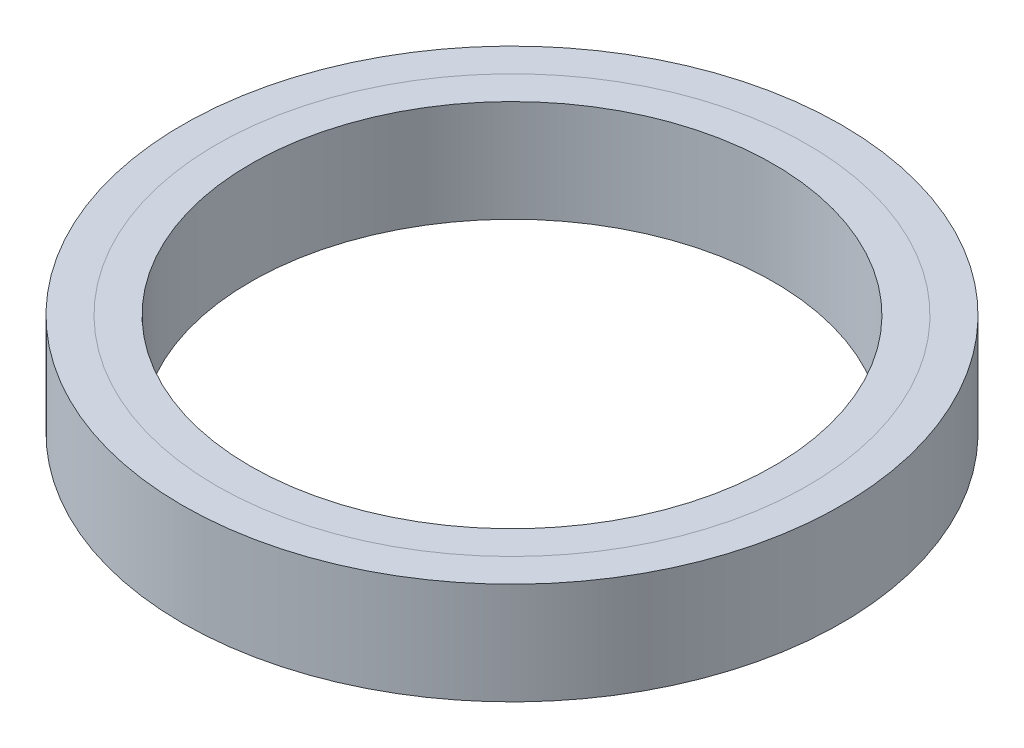
ISO-10303-21;
HEADER;
FILE_DESCRIPTION(('STEP AP214'),'2;1');
FILE_NAME('part.step','',(''),(''),'','','');
FILE_SCHEMA(('AUTOMOTIVE_DESIGN { 1 0 10303 214 1 1 1 1 }'));
ENDSEC;
DATA;
#1=APPLICATION_CONTEXT('core data for automotive mechanical design processes');
#2=APPLICATION_PROTOCOL_DEFINITION('international standard','automotive_design',2000,#1);
#3=PRODUCT_CONTEXT('',#1,'mechanical');
#4=PRODUCT('Part','Part','',(#3));
#5=PRODUCT_RELATED_PRODUCT_CATEGORY('part','',(#4));
#6=PRODUCT_DEFINITION_FORMATION('','',#4);
#7=PRODUCT_DEFINITION_CONTEXT('part definition',#1,'design');
#8=PRODUCT_DEFINITION('design','',#6,#7);
#9=PRODUCT_DEFINITION_SHAPE('','',#8);
#10=(LENGTH_UNIT() NAMED_UNIT(*) SI_UNIT(.MILLI.,.METRE.));
#11=(NAMED_UNIT(*) PLANE_ANGLE_UNIT() SI_UNIT($,.RADIAN.));
#12=(NAMED_UNIT(*) SI_UNIT($,.STERADIAN.) SOLID_ANGLE_UNIT());
#13=UNCERTAINTY_MEASURE_WITH_UNIT(LENGTH_MEASURE(1.E-05),#10,'distance_accuracy_value','');
#14=(GEOMETRIC_REPRESENTATION_CONTEXT(3) GLOBAL_UNCERTAINTY_ASSIGNED_CONTEXT((#13)) GLOBAL_UNIT_ASSIGNED_CONTEXT((#10,
#11,#12)) REPRESENTATION_CONTEXT('',''));
#15=CARTESIAN_POINT('',(0.,0.,0.));
#16=DIRECTION('',(0.,0.,1.));
#17=DIRECTION('',(1.,0.,0.));
#18=AXIS2_PLACEMENT_3D('',#15,#16,#17);
#19=CARTESIAN_POINT('',(0.,7.5,0.));
#20=DIRECTION('',(0.,1.,0.));
#21=DIRECTION('',(0.,0.,1.));
#22=AXIS2_PLACEMENT_3D('',#19,#20,#21);
#23=PLANE('',#22);
#24=CARTESIAN_POINT('',(0.,7.5,0.));
#25=DIRECTION('',(0.,1.,0.));
#26=DIRECTION('',(0.,0.,1.));
#27=AXIS2_PLACEMENT_3D('',#24,#25,#26);
#28=CIRCLE('',#27,48.5);
#29=CARTESIAN_POINT('',(0.,7.5,48.5));
#30=VERTEX_POINT('',#29);
#31=EDGE_CURVE('E11',#30,#30,#28,.T.);
#32=ORIENTED_EDGE('',*,*,#31,.T.);
#33=EDGE_LOOP('',(#32));
#34=FACE_BOUND('',#33,.T.);
#35=CARTESIAN_POINT('',(0.,7.5,0.));
#36=DIRECTION('',(0.,1.,0.));
#37=DIRECTION('',(0.,0.,1.));
#38=AXIS2_PLACEMENT_3D('',#35,#36,#37);
#39=CIRCLE('',#38,43.5);
#40=CARTESIAN_POINT('',(0.,7.5,43.5));
#41=VERTEX_POINT('',#40);
#42=EDGE_CURVE('E50',#41,#41,#39,.T.);
#43=ORIENTED_EDGE('',*,*,#42,.F.);
#44=EDGE_LOOP('',(#43));
#45=FACE_BOUND('',#44,.T.);
#46=ADVANCED_FACE('F39',(#34,#45),#23,.T.);
#47=CARTESIAN_POINT('',(0.,-7.5,0.));
#48=DIRECTION('',(0.,1.,0.));
#49=DIRECTION('',(0.,0.,1.));
#50=AXIS2_PLACEMENT_3D('',#47,#48,#49);
#51=PLANE('',#50);
#52=CARTESIAN_POINT('',(0.,-7.5,0.));
#53=DIRECTION('',(0.,1.,0.));
#54=DIRECTION('',(0.,0.,1.));
#55=AXIS2_PLACEMENT_3D('',#52,#53,#54);
#56=CIRCLE('',#55,48.5);
#57=CARTESIAN_POINT('',(0.,-7.5,48.5));
#58=VERTEX_POINT('',#57);
#59=EDGE_CURVE('E43',#58,#58,#56,.T.);
#60=ORIENTED_EDGE('',*,*,#59,.F.);
#61=EDGE_LOOP('',(#60));
#62=FACE_BOUND('',#61,.T.);
#63=CARTESIAN_POINT('',(0.,-7.5,0.));
#64=DIRECTION('',(0.,1.,0.));
#65=DIRECTION('',(0.,0.,1.));
#66=AXIS2_PLACEMENT_3D('',#63,#64,#65);
#67=CIRCLE('',#66,43.5);
#68=CARTESIAN_POINT('',(0.,-7.5,43.5));
#69=VERTEX_POINT('',#68);
#70=EDGE_CURVE('E52',#69,#69,#67,.T.);
#71=ORIENTED_EDGE('',*,*,#70,.T.);
#72=EDGE_LOOP('',(#71));
#73=FACE_BOUND('',#72,.T.);
#74=ADVANCED_FACE('F62',(#62,#73),#51,.F.);
#75=CARTESIAN_POINT('',(0.,7.5,0.));
#76=DIRECTION('',(0.,-1.,0.));
#77=DIRECTION('',(0.,0.,-1.));
#78=AXIS2_PLACEMENT_3D('',#75,#76,#77);
#79=CYLINDRICAL_SURFACE('',#78,48.5);
#80=ORIENTED_EDGE('',*,*,#31,.F.);
#81=EDGE_LOOP('',(#80));
#82=FACE_BOUND('',#81,.T.);
#83=ORIENTED_EDGE('',*,*,#59,.T.);
#84=EDGE_LOOP('',(#83));
#85=FACE_BOUND('',#84,.T.);
#86=ADVANCED_FACE('F41',(#82,#85),#79,.T.);
#87=CARTESIAN_POINT('',(0.,7.5,0.));
#88=DIRECTION('',(0.,-1.,0.));
#89=DIRECTION('',(0.,0.,-1.));
#90=AXIS2_PLACEMENT_3D('',#87,#88,#89);
#91=CYLINDRICAL_SURFACE('',#90,43.5);
#92=ORIENTED_EDGE('',*,*,#42,.T.);
#93=EDGE_LOOP('',(#92));
#94=FACE_BOUND('',#93,.T.);
#95=ORIENTED_EDGE('',*,*,#70,.F.);
#96=EDGE_LOOP('',(#95));
#97=FACE_BOUND('',#96,.T.);
#98=ADVANCED_FACE('F58',(#94,#97),#91,.F.);
#99=CLOSED_SHELL('',(#46,#74,#86,#98));
#100=MANIFOLD_SOLID_BREP('B2',#99);
#101=CARTESIAN_POINT('',(0.,7.5,0.));
#102=DIRECTION('',(0.,1.,0.));
#103=DIRECTION('',(0.,0.,1.));
#104=AXIS2_PLACEMENT_3D('',#101,#102,#103);
#105=PLANE('',#104);
#106=CARTESIAN_POINT('',(0.,7.5,0.));
#107=DIRECTION('',(0.,1.,0.));
#108=DIRECTION('',(0.,0.,1.));
#109=AXIS2_PLACEMENT_3D('',#106,#107,#108);
#110=CIRCLE('',#109,43.5);
#111=CARTESIAN_POINT('',(0.,7.5,43.5));
#112=VERTEX_POINT('',#111);
#113=EDGE_CURVE('E38',#112,#112,#110,.T.);
#114=ORIENTED_EDGE('',*,*,#113,.T.);
#115=EDGE_LOOP('',(#114));
#116=FACE_BOUND('',#115,.T.);
#117=CARTESIAN_POINT('',(0.,7.5,0.));
#118=DIRECTION('',(0.,1.,0.));
#119=DIRECTION('',(0.,0.,1.));
#120=AXIS2_PLACEMENT_3D('',#117,#118,#119);
#121=CIRCLE('',#120,38.5);
#122=CARTESIAN_POINT('',(0.,7.5,38.5));
#123=VERTEX_POINT('',#122);
#124=EDGE_CURVE('E112',#123,#123,#121,.T.);
#125=ORIENTED_EDGE('',*,*,#124,.F.);
#126=EDGE_LOOP('',(#125));
#127=FACE_BOUND('',#126,.T.);
#128=ADVANCED_FACE('F101',(#116,#127),#105,.T.);
#129=CARTESIAN_POINT('',(0.,-7.5,0.));
#130=DIRECTION('',(0.,1.,0.));
#131=DIRECTION('',(0.,0.,1.));
#132=AXIS2_PLACEMENT_3D('',#129,#130,#131);
#133=PLANE('',#132);
#134=CARTESIAN_POINT('',(0.,-7.5,0.));
#135=DIRECTION('',(0.,1.,0.));
#136=DIRECTION('',(0.,0.,1.));
#137=AXIS2_PLACEMENT_3D('',#134,#135,#136);
#138=CIRCLE('',#137,43.5);
#139=CARTESIAN_POINT('',(0.,-7.5,43.5));
#140=VERTEX_POINT('',#139);
#141=EDGE_CURVE('E105',#140,#140,#138,.T.);
#142=ORIENTED_EDGE('',*,*,#141,.F.);
#143=EDGE_LOOP('',(#142));
#144=FACE_BOUND('',#143,.T.);
#145=CARTESIAN_POINT('',(0.,-7.5,0.));
#146=DIRECTION('',(0.,1.,0.));
#147=DIRECTION('',(0.,0.,1.));
#148=AXIS2_PLACEMENT_3D('',#145,#146,#147);
#149=CIRCLE('',#148,38.5);
#150=CARTESIAN_POINT('',(0.,-7.5,38.5));
#151=VERTEX_POINT('',#150);
#152=EDGE_CURVE('E114',#151,#151,#149,.T.);
#153=ORIENTED_EDGE('',*,*,#152,.T.);
#154=EDGE_LOOP('',(#153));
#155=FACE_BOUND('',#154,.T.);
#156=ADVANCED_FACE('F124',(#144,#155),#133,.F.);
#157=CARTESIAN_POINT('',(0.,7.5,0.));
#158=DIRECTION('',(0.,-1.,0.));
#159=DIRECTION('',(0.,0.,-1.));
#160=AXIS2_PLACEMENT_3D('',#157,#158,#159);
#161=CYLINDRICAL_SURFACE('',#160,43.5);
#162=ORIENTED_EDGE('',*,*,#113,.F.);
#163=EDGE_LOOP('',(#162));
#164=FACE_BOUND('',#163,.T.);
#165=ORIENTED_EDGE('',*,*,#141,.T.);
#166=EDGE_LOOP('',(#165));
#167=FACE_BOUND('',#166,.T.);
#168=ADVANCED_FACE('F103',(#164,#167),#161,.T.);
#169=CARTESIAN_POINT('',(0.,7.5,0.));
#170=DIRECTION('',(0.,-1.,0.));
#171=DIRECTION('',(0.,0.,-1.));
#172=AXIS2_PLACEMENT_3D('',#169,#170,#171);
#173=CYLINDRICAL_SURFACE('',#172,38.5);
#174=ORIENTED_EDGE('',*,*,#124,.T.);
#175=EDGE_LOOP('',(#174));
#176=FACE_BOUND('',#175,.T.);
#177=ORIENTED_EDGE('',*,*,#152,.F.);
#178=EDGE_LOOP('',(#177));
#179=FACE_BOUND('',#178,.T.);
#180=ADVANCED_FACE('F120',(#176,#179),#173,.F.);
#181=CLOSED_SHELL('',(#128,#156,#168,#180));
#182=MANIFOLD_SOLID_BREP('B6',#181);
#183=ADVANCED_BREP_SHAPE_REPRESENTATION('',(#18,#100,#182),#14);
#184=SHAPE_DEFINITION_REPRESENTATION(#9,#183);
ENDSEC;
END-ISO-10303-21;
